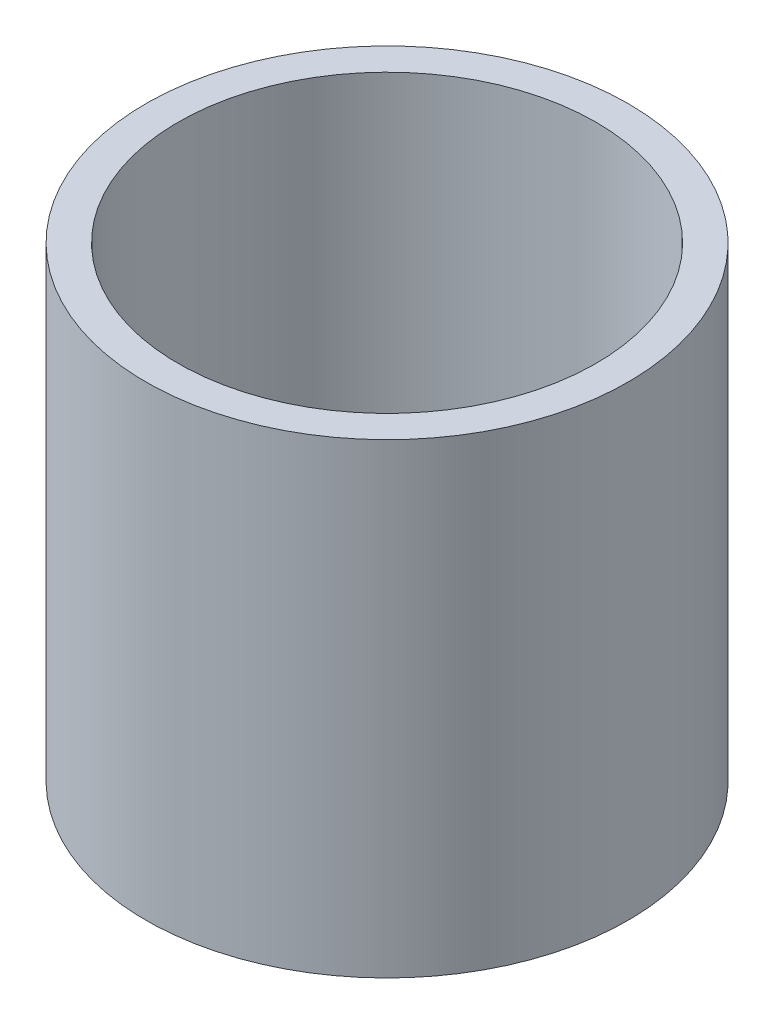
ISO-10303-21;
HEADER;
FILE_DESCRIPTION(('STEP AP214'),'2;1');
FILE_NAME('part.step','',(''),(''),'','','');
FILE_SCHEMA(('AUTOMOTIVE_DESIGN { 1 0 10303 214 1 1 1 1 }'));
ENDSEC;
DATA;
#1=APPLICATION_CONTEXT('core data for automotive mechanical design processes');
#2=APPLICATION_PROTOCOL_DEFINITION('international standard','automotive_design',2000,#1);
#3=PRODUCT_CONTEXT('',#1,'mechanical');
#4=PRODUCT('Part','Part','',(#3));
#5=PRODUCT_RELATED_PRODUCT_CATEGORY('part','',(#4));
#6=PRODUCT_DEFINITION_FORMATION('','',#4);
#7=PRODUCT_DEFINITION_CONTEXT('part definition',#1,'design');
#8=PRODUCT_DEFINITION('design','',#6,#7);
#9=PRODUCT_DEFINITION_SHAPE('','',#8);
#10=(LENGTH_UNIT() NAMED_UNIT(*) SI_UNIT(.MILLI.,.METRE.));
#11=(NAMED_UNIT(*) PLANE_ANGLE_UNIT() SI_UNIT($,.RADIAN.));
#12=(NAMED_UNIT(*) SI_UNIT($,.STERADIAN.) SOLID_ANGLE_UNIT());
#13=UNCERTAINTY_MEASURE_WITH_UNIT(LENGTH_MEASURE(1.E-05),#10,'distance_accuracy_value','');
#14=(GEOMETRIC_REPRESENTATION_CONTEXT(3) GLOBAL_UNCERTAINTY_ASSIGNED_CONTEXT((#13)) GLOBAL_UNIT_ASSIGNED_CONTEXT((#10,
#11,#12)) REPRESENTATION_CONTEXT('',''));
#15=CARTESIAN_POINT('',(0.,0.,0.));
#16=DIRECTION('',(0.,0.,1.));
#17=DIRECTION('',(1.,0.,0.));
#18=AXIS2_PLACEMENT_3D('',#15,#16,#17);
#19=CARTESIAN_POINT('',(3.,0.,0.));
#20=DIRECTION('',(0.,-1.,0.));
#21=DIRECTION('',(0.,0.,-1.));
#22=AXIS2_PLACEMENT_3D('',#19,#20,#21);
#23=PLANE('',#22);
#24=CARTESIAN_POINT('',(0.,0.,0.));
#25=DIRECTION('',(0.,-1.,0.));
#26=DIRECTION('',(0.,0.,-1.));
#27=AXIS2_PLACEMENT_3D('',#24,#25,#26);
#28=CIRCLE('',#27,3.);
#29=CARTESIAN_POINT('',(0.,0.,-3.));
#30=VERTEX_POINT('',#29);
#31=EDGE_CURVE('E10',#30,#30,#28,.T.);
#32=ORIENTED_EDGE('',*,*,#31,.T.);
#33=EDGE_LOOP('',(#32));
#34=FACE_BOUND('',#33,.T.);
#35=ADVANCED_FACE('F43',(#34),#23,.T.);
#36=CARTESIAN_POINT('',(0.,0.,0.));
#37=DIRECTION('',(0.,-1.,0.));
#38=DIRECTION('',(0.,0.,-1.));
#39=AXIS2_PLACEMENT_3D('',#36,#37,#38);
#40=CYLINDRICAL_SURFACE('',#39,3.);
#41=CARTESIAN_POINT('',(0.,5.8,0.));
#42=DIRECTION('',(0.,-1.,0.));
#43=DIRECTION('',(0.,0.,-1.));
#44=AXIS2_PLACEMENT_3D('',#41,#42,#43);
#45=CIRCLE('',#44,3.);
#46=CARTESIAN_POINT('',(0.,5.8,-3.));
#47=VERTEX_POINT('',#46);
#48=EDGE_CURVE('E50',#47,#47,#45,.T.);
#49=ORIENTED_EDGE('',*,*,#48,.T.);
#50=EDGE_LOOP('',(#49));
#51=FACE_BOUND('',#50,.T.);
#52=ORIENTED_EDGE('',*,*,#31,.F.);
#53=EDGE_LOOP('',(#52));
#54=FACE_BOUND('',#53,.T.);
#55=ADVANCED_FACE('F83',(#51,#54),#40,.T.);
#56=CARTESIAN_POINT('',(2.6,5.8,0.));
#57=DIRECTION('',(0.,1.,0.));
#58=DIRECTION('',(0.,0.,1.));
#59=AXIS2_PLACEMENT_3D('',#56,#57,#58);
#60=PLANE('',#59);
#61=CARTESIAN_POINT('',(0.,5.8,0.));
#62=DIRECTION('',(0.,-1.,0.));
#63=DIRECTION('',(0.,0.,-1.));
#64=AXIS2_PLACEMENT_3D('',#61,#62,#63);
#65=CIRCLE('',#64,2.6);
#66=CARTESIAN_POINT('',(0.,5.8,-2.6));
#67=VERTEX_POINT('',#66);
#68=EDGE_CURVE('E55',#67,#67,#65,.T.);
#69=ORIENTED_EDGE('',*,*,#68,.T.);
#70=EDGE_LOOP('',(#69));
#71=FACE_BOUND('',#70,.T.);
#72=ORIENTED_EDGE('',*,*,#48,.F.);
#73=EDGE_LOOP('',(#72));
#74=FACE_BOUND('',#73,.T.);
#75=ADVANCED_FACE('F87',(#71,#74),#60,.T.);
#76=CARTESIAN_POINT('',(0.,0.,0.));
#77=DIRECTION('',(0.,-1.,0.));
#78=DIRECTION('',(0.,0.,-1.));
#79=AXIS2_PLACEMENT_3D('',#76,#77,#78);
#80=CYLINDRICAL_SURFACE('',#79,2.6);
#81=CARTESIAN_POINT('',(0.,1.6,0.));
#82=DIRECTION('',(0.,-1.,0.));
#83=DIRECTION('',(0.,0.,-1.));
#84=AXIS2_PLACEMENT_3D('',#81,#82,#83);
#85=CIRCLE('',#84,2.6);
#86=CARTESIAN_POINT('',(0.,1.6,-2.6));
#87=VERTEX_POINT('',#86);
#88=EDGE_CURVE('E60',#87,#87,#85,.T.);
#89=ORIENTED_EDGE('',*,*,#88,.T.);
#90=EDGE_LOOP('',(#89));
#91=FACE_BOUND('',#90,.T.);
#92=ORIENTED_EDGE('',*,*,#68,.F.);
#93=EDGE_LOOP('',(#92));
#94=FACE_BOUND('',#93,.T.);
#95=ADVANCED_FACE('F80',(#91,#94),#80,.F.);
#96=CARTESIAN_POINT('',(0.,1.6,0.));
#97=DIRECTION('',(0.,-1.,0.));
#98=DIRECTION('',(0.,0.,-1.));
#99=AXIS2_PLACEMENT_3D('',#96,#97,#98);
#100=TOROIDAL_SURFACE('',#99,1.8,0.8);
#101=CARTESIAN_POINT('',(0.,0.8,0.));
#102=DIRECTION('',(0.,-1.,0.));
#103=DIRECTION('',(0.,0.,-1.));
#104=AXIS2_PLACEMENT_3D('',#101,#102,#103);
#105=CIRCLE('',#104,1.8);
#106=CARTESIAN_POINT('',(0.,0.8,-1.8));
#107=VERTEX_POINT('',#106);
#108=EDGE_CURVE('E66',#107,#107,#105,.T.);
#109=ORIENTED_EDGE('',*,*,#108,.T.);
#110=EDGE_LOOP('',(#109));
#111=FACE_BOUND('',#110,.T.);
#112=ORIENTED_EDGE('',*,*,#88,.F.);
#113=EDGE_LOOP('',(#112));
#114=FACE_BOUND('',#113,.T.);
#115=ADVANCED_FACE('F71',(#111,#114),#100,.F.);
#116=CARTESIAN_POINT('',(0.,0.8,0.));
#117=DIRECTION('',(0.,1.,0.));
#118=DIRECTION('',(0.,0.,1.));
#119=AXIS2_PLACEMENT_3D('',#116,#117,#118);
#120=PLANE('',#119);
#121=ORIENTED_EDGE('',*,*,#108,.F.);
#122=EDGE_LOOP('',(#121));
#123=FACE_BOUND('',#122,.T.);
#124=ADVANCED_FACE('F74',(#123),#120,.T.);
#125=CLOSED_SHELL('',(#35,#55,#75,#95,#115,#124));
#126=MANIFOLD_SOLID_BREP('B2',#125);
#127=ADVANCED_BREP_SHAPE_REPRESENTATION('',(#18,#126),#14);
#128=SHAPE_DEFINITION_REPRESENTATION(#9,#127);
ENDSEC;
END-ISO-10303-21;
